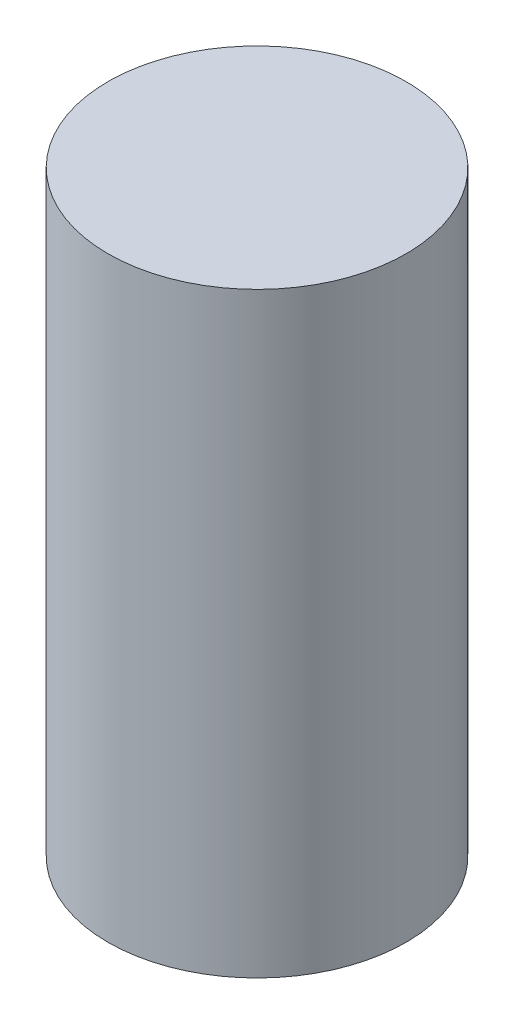
ISO-10303-21;
HEADER;
FILE_DESCRIPTION(('STEP AP214'),'2;1');
FILE_NAME('part.step','',(''),(''),'','','');
FILE_SCHEMA(('AUTOMOTIVE_DESIGN { 1 0 10303 214 1 1 1 1 }'));
ENDSEC;
DATA;
#1=APPLICATION_CONTEXT('core data for automotive mechanical design processes');
#2=APPLICATION_PROTOCOL_DEFINITION('international standard','automotive_design',2000,#1);
#3=PRODUCT_CONTEXT('',#1,'mechanical');
#4=PRODUCT('Part','Part','',(#3));
#5=PRODUCT_RELATED_PRODUCT_CATEGORY('part','',(#4));
#6=PRODUCT_DEFINITION_FORMATION('','',#4);
#7=PRODUCT_DEFINITION_CONTEXT('part definition',#1,'design');
#8=PRODUCT_DEFINITION('design','',#6,#7);
#9=PRODUCT_DEFINITION_SHAPE('','',#8);
#10=(LENGTH_UNIT() NAMED_UNIT(*) SI_UNIT(.MILLI.,.METRE.));
#11=(NAMED_UNIT(*) PLANE_ANGLE_UNIT() SI_UNIT($,.RADIAN.));
#12=(NAMED_UNIT(*) SI_UNIT($,.STERADIAN.) SOLID_ANGLE_UNIT());
#13=UNCERTAINTY_MEASURE_WITH_UNIT(LENGTH_MEASURE(1.E-05),#10,'distance_accuracy_value','');
#14=(GEOMETRIC_REPRESENTATION_CONTEXT(3) GLOBAL_UNCERTAINTY_ASSIGNED_CONTEXT((#13)) GLOBAL_UNIT_ASSIGNED_CONTEXT((#10,
#11,#12)) REPRESENTATION_CONTEXT('',''));
#15=CARTESIAN_POINT('',(0.,0.,0.));
#16=DIRECTION('',(0.,0.,1.));
#17=DIRECTION('',(1.,0.,0.));
#18=AXIS2_PLACEMENT_3D('',#15,#16,#17);
#19=CARTESIAN_POINT('',(0.,400.,0.));
#20=DIRECTION('',(0.,-1.,0.));
#21=DIRECTION('',(0.,0.,-1.));
#22=AXIS2_PLACEMENT_3D('',#19,#20,#21);
#23=CYLINDRICAL_SURFACE('',#22,100.);
#24=CARTESIAN_POINT('',(0.,400.,0.));
#25=DIRECTION('',(0.,1.,0.));
#26=DIRECTION('',(0.,0.,1.));
#27=AXIS2_PLACEMENT_3D('',#24,#25,#26);
#28=CIRCLE('',#27,100.);
#29=CARTESIAN_POINT('',(0.,400.,100.));
#30=VERTEX_POINT('',#29);
#31=EDGE_CURVE('E10',#30,#30,#28,.T.);
#32=ORIENTED_EDGE('',*,*,#31,.F.);
#33=EDGE_LOOP('',(#32));
#34=FACE_BOUND('',#33,.T.);
#35=CARTESIAN_POINT('',(0.,0.,0.));
#36=DIRECTION('',(0.,1.,0.));
#37=DIRECTION('',(0.,0.,1.));
#38=AXIS2_PLACEMENT_3D('',#35,#36,#37);
#39=CIRCLE('',#38,100.);
#40=CARTESIAN_POINT('',(0.,0.,100.));
#41=VERTEX_POINT('',#40);
#42=EDGE_CURVE('E40',#41,#41,#39,.T.);
#43=ORIENTED_EDGE('',*,*,#42,.T.);
#44=EDGE_LOOP('',(#43));
#45=FACE_BOUND('',#44,.T.);
#46=ADVANCED_FACE('F37',(#34,#45),#23,.T.);
#47=CARTESIAN_POINT('',(0.,400.,0.));
#48=DIRECTION('',(0.,1.,0.));
#49=DIRECTION('',(0.,0.,1.));
#50=AXIS2_PLACEMENT_3D('',#47,#48,#49);
#51=PLANE('',#50);
#52=ORIENTED_EDGE('',*,*,#31,.T.);
#53=EDGE_LOOP('',(#52));
#54=FACE_BOUND('',#53,.T.);
#55=ADVANCED_FACE('F54',(#54),#51,.T.);
#56=CARTESIAN_POINT('',(0.,0.,0.));
#57=DIRECTION('',(0.,1.,0.));
#58=DIRECTION('',(0.,0.,1.));
#59=AXIS2_PLACEMENT_3D('',#56,#57,#58);
#60=PLANE('',#59);
#61=ORIENTED_EDGE('',*,*,#42,.F.);
#62=EDGE_LOOP('',(#61));
#63=FACE_BOUND('',#62,.T.);
#64=ADVANCED_FACE('F52',(#63),#60,.F.);
#65=CLOSED_SHELL('',(#46,#55,#64));
#66=MANIFOLD_SOLID_BREP('B2',#65);
#67=ADVANCED_BREP_SHAPE_REPRESENTATION('',(#18,#66),#14);
#68=SHAPE_DEFINITION_REPRESENTATION(#9,#67);
ENDSEC;
END-ISO-10303-21;
